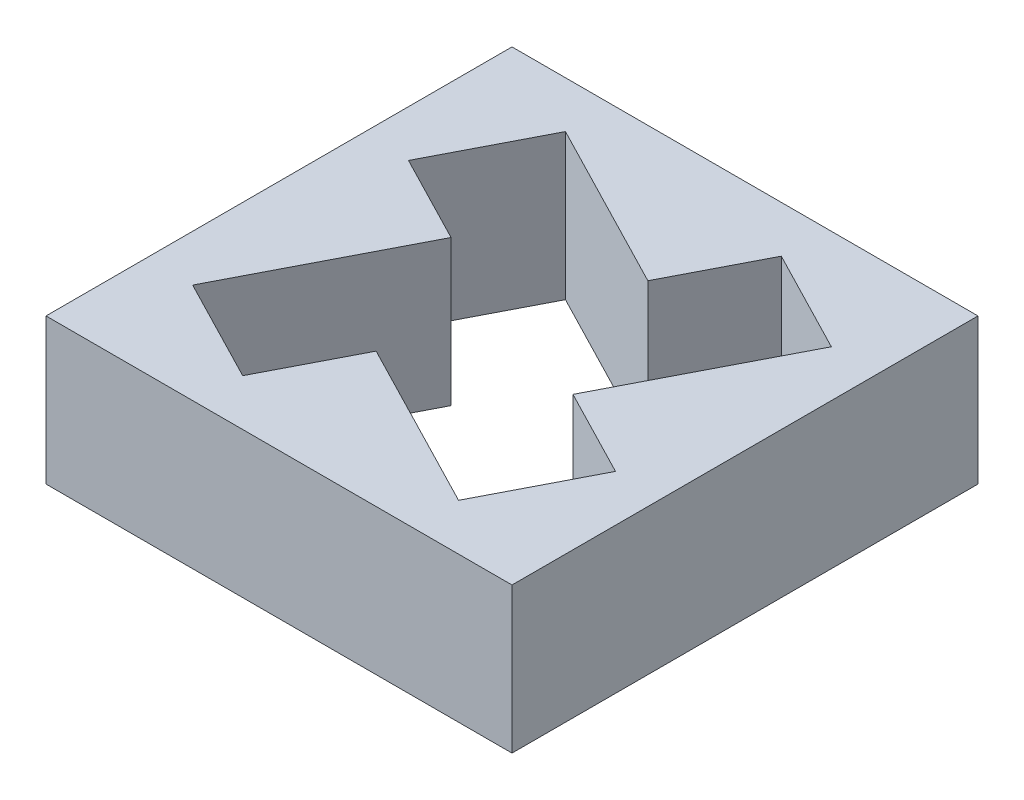
ISO-10303-21;
HEADER;
FILE_DESCRIPTION(('STEP AP214'),'2;1');
FILE_NAME('part.step','',(''),(''),'','','');
FILE_SCHEMA(('AUTOMOTIVE_DESIGN { 1 0 10303 214 1 1 1 1 }'));
ENDSEC;
DATA;
#1=APPLICATION_CONTEXT('core data for automotive mechanical design processes');
#2=APPLICATION_PROTOCOL_DEFINITION('international standard','automotive_design',2000,#1);
#3=PRODUCT_CONTEXT('',#1,'mechanical');
#4=PRODUCT('Part','Part','',(#3));
#5=PRODUCT_RELATED_PRODUCT_CATEGORY('part','',(#4));
#6=PRODUCT_DEFINITION_FORMATION('','',#4);
#7=PRODUCT_DEFINITION_CONTEXT('part definition',#1,'design');
#8=PRODUCT_DEFINITION('design','',#6,#7);
#9=PRODUCT_DEFINITION_SHAPE('','',#8);
#10=(LENGTH_UNIT() NAMED_UNIT(*) SI_UNIT(.MILLI.,.METRE.));
#11=(NAMED_UNIT(*) PLANE_ANGLE_UNIT() SI_UNIT($,.RADIAN.));
#12=(NAMED_UNIT(*) SI_UNIT($,.STERADIAN.) SOLID_ANGLE_UNIT());
#13=UNCERTAINTY_MEASURE_WITH_UNIT(LENGTH_MEASURE(1.E-05),#10,'distance_accuracy_value','');
#14=(GEOMETRIC_REPRESENTATION_CONTEXT(3) GLOBAL_UNCERTAINTY_ASSIGNED_CONTEXT((#13)) GLOBAL_UNIT_ASSIGNED_CONTEXT((#10,
#11,#12)) REPRESENTATION_CONTEXT('',''));
#15=CARTESIAN_POINT('',(0.,0.,0.));
#16=DIRECTION('',(0.,0.,1.));
#17=DIRECTION('',(1.,0.,0.));
#18=AXIS2_PLACEMENT_3D('',#15,#16,#17);
#19=CARTESIAN_POINT('',(0.,25.,0.));
#20=DIRECTION('',(1.,0.,0.));
#21=DIRECTION('',(0.,0.,-1.));
#22=AXIS2_PLACEMENT_3D('',#19,#20,#21);
#23=PLANE('',#22);
#24=DIRECTION('',(0.,0.,1.));
#25=VECTOR('',#24,1.);
#26=CARTESIAN_POINT('',(0.,0.,0.));
#27=LINE('',#26,#25);
#28=CARTESIAN_POINT('',(0.,0.,-80.));
#29=VERTEX_POINT('',#28);
#30=CARTESIAN_POINT('',(0.,0.,0.));
#31=VERTEX_POINT('',#30);
#32=EDGE_CURVE('E259',#29,#31,#27,.T.);
#33=ORIENTED_EDGE('',*,*,#32,.T.);
#34=DIRECTION('',(0.,-1.,0.));
#35=VECTOR('',#34,1.);
#36=CARTESIAN_POINT('',(0.,25.,0.));
#37=LINE('',#36,#35);
#38=CARTESIAN_POINT('',(0.,25.,0.));
#39=VERTEX_POINT('',#38);
#40=EDGE_CURVE('E11',#39,#31,#37,.T.);
#41=ORIENTED_EDGE('',*,*,#40,.F.);
#42=DIRECTION('',(0.,0.,1.));
#43=VECTOR('',#42,1.);
#44=CARTESIAN_POINT('',(0.,25.,0.));
#45=LINE('',#44,#43);
#46=CARTESIAN_POINT('',(0.,25.,-80.));
#47=VERTEX_POINT('',#46);
#48=EDGE_CURVE('E289',#47,#39,#45,.T.);
#49=ORIENTED_EDGE('',*,*,#48,.F.);
#50=DIRECTION('',(0.,-1.,0.));
#51=VECTOR('',#50,1.);
#52=CARTESIAN_POINT('',(0.,25.,-80.));
#53=LINE('',#52,#51);
#54=EDGE_CURVE('E303',#47,#29,#53,.T.);
#55=ORIENTED_EDGE('',*,*,#54,.T.);
#56=EDGE_LOOP('',(#33,#41,#49,#55));
#57=FACE_BOUND('',#56,.T.);
#58=ADVANCED_FACE('F39',(#57),#23,.F.);
#59=CARTESIAN_POINT('',(0.,25.,0.));
#60=DIRECTION('',(0.,0.,-1.));
#61=DIRECTION('',(-1.,0.,0.));
#62=AXIS2_PLACEMENT_3D('',#59,#60,#61);
#63=PLANE('',#62);
#64=DIRECTION('',(1.,0.,0.));
#65=VECTOR('',#64,1.);
#66=CARTESIAN_POINT('',(0.,0.,0.));
#67=LINE('',#66,#65);
#68=CARTESIAN_POINT('',(80.,0.,0.));
#69=VERTEX_POINT('',#68);
#70=EDGE_CURVE('E307',#31,#69,#67,.T.);
#71=ORIENTED_EDGE('',*,*,#70,.T.);
#72=DIRECTION('',(0.,-1.,0.));
#73=VECTOR('',#72,1.);
#74=CARTESIAN_POINT('',(80.,25.,0.));
#75=LINE('',#74,#73);
#76=CARTESIAN_POINT('',(80.,25.,0.));
#77=VERTEX_POINT('',#76);
#78=EDGE_CURVE('E47',#77,#69,#75,.T.);
#79=ORIENTED_EDGE('',*,*,#78,.F.);
#80=DIRECTION('',(1.,0.,0.));
#81=VECTOR('',#80,1.);
#82=CARTESIAN_POINT('',(0.,25.,0.));
#83=LINE('',#82,#81);
#84=EDGE_CURVE('E293',#39,#77,#83,.T.);
#85=ORIENTED_EDGE('',*,*,#84,.F.);
#86=ORIENTED_EDGE('',*,*,#40,.T.);
#87=EDGE_LOOP('',(#71,#79,#85,#86));
#88=FACE_BOUND('',#87,.T.);
#89=ADVANCED_FACE('F341',(#88),#63,.F.);
#90=CARTESIAN_POINT('',(80.,25.,0.));
#91=DIRECTION('',(-1.,0.,0.));
#92=DIRECTION('',(0.,0.,1.));
#93=AXIS2_PLACEMENT_3D('',#90,#91,#92);
#94=PLANE('',#93);
#95=DIRECTION('',(0.,0.,-1.));
#96=VECTOR('',#95,1.);
#97=CARTESIAN_POINT('',(80.,0.,0.));
#98=LINE('',#97,#96);
#99=CARTESIAN_POINT('',(80.,0.,-80.));
#100=VERTEX_POINT('',#99);
#101=EDGE_CURVE('E310',#69,#100,#98,.T.);
#102=ORIENTED_EDGE('',*,*,#101,.T.);
#103=DIRECTION('',(0.,-1.,0.));
#104=VECTOR('',#103,1.);
#105=CARTESIAN_POINT('',(80.,25.,-80.));
#106=LINE('',#105,#104);
#107=CARTESIAN_POINT('',(80.,25.,-80.));
#108=VERTEX_POINT('',#107);
#109=EDGE_CURVE('E318',#108,#100,#106,.T.);
#110=ORIENTED_EDGE('',*,*,#109,.F.);
#111=DIRECTION('',(0.,0.,-1.));
#112=VECTOR('',#111,1.);
#113=CARTESIAN_POINT('',(80.,25.,0.));
#114=LINE('',#113,#112);
#115=EDGE_CURVE('E297',#77,#108,#114,.T.);
#116=ORIENTED_EDGE('',*,*,#115,.F.);
#117=ORIENTED_EDGE('',*,*,#78,.T.);
#118=EDGE_LOOP('',(#102,#110,#116,#117));
#119=FACE_BOUND('',#118,.T.);
#120=ADVANCED_FACE('F327',(#119),#94,.F.);
#121=CARTESIAN_POINT('',(0.,25.,-80.));
#122=DIRECTION('',(0.,0.,1.));
#123=DIRECTION('',(1.,0.,0.));
#124=AXIS2_PLACEMENT_3D('',#121,#122,#123);
#125=PLANE('',#124);
#126=DIRECTION('',(-1.,0.,0.));
#127=VECTOR('',#126,1.);
#128=CARTESIAN_POINT('',(0.,0.,-80.));
#129=LINE('',#128,#127);
#130=EDGE_CURVE('E294',#100,#29,#129,.T.);
#131=ORIENTED_EDGE('',*,*,#130,.T.);
#132=ORIENTED_EDGE('',*,*,#54,.F.);
#133=DIRECTION('',(-1.,0.,0.));
#134=VECTOR('',#133,1.);
#135=CARTESIAN_POINT('',(0.,25.,-80.));
#136=LINE('',#135,#134);
#137=EDGE_CURVE('E300',#108,#47,#136,.T.);
#138=ORIENTED_EDGE('',*,*,#137,.F.);
#139=ORIENTED_EDGE('',*,*,#109,.T.);
#140=EDGE_LOOP('',(#131,#132,#138,#139));
#141=FACE_BOUND('',#140,.T.);
#142=ADVANCED_FACE('F334',(#141),#125,.F.);
#143=CARTESIAN_POINT('',(0.,25.,0.));
#144=DIRECTION('',(0.,-1.,0.));
#145=DIRECTION('',(0.,0.,-1.));
#146=AXIS2_PLACEMENT_3D('',#143,#144,#145);
#147=PLANE('',#146);
#148=DIRECTION('',(-0.458799627653541,0.,0.888539758066555));
#149=VECTOR('',#148,1.);
#150=CARTESIAN_POINT('',(-15.7911471716284,25.,-8.15379658230523));
#151=LINE('',#150,#149);
#152=CARTESIAN_POINT('',(17.1759925530708,25.,-72.));
#153=VERTEX_POINT('',#152);
#154=CARTESIAN_POINT('',(8.,25.,-54.2292048386689));
#155=VERTEX_POINT('',#154);
#156=EDGE_CURVE('E218',#153,#155,#151,.T.);
#157=ORIENTED_EDGE('',*,*,#156,.F.);
#158=DIRECTION('',(-0.888539758066555,0.,-0.458799627653541));
#159=VECTOR('',#158,1.);
#160=CARTESIAN_POINT('',(32.9671397246993,25.,-63.8462034176947));
#161=LINE('',#160,#159);
#162=CARTESIAN_POINT('',(46.4296111685587,25.,-56.8948241128685));
#163=VERTEX_POINT('',#162);
#164=EDGE_CURVE('E54',#163,#153,#161,.T.);
#165=ORIENTED_EDGE('',*,*,#164,.F.);
#166=DIRECTION('',(-0.458799627653541,0.,0.888539758066555));
#167=VECTOR('',#166,1.);
#168=CARTESIAN_POINT('',(13.4624714438594,25.,6.95137930482621));
#169=LINE('',#168,#167);
#170=CARTESIAN_POINT('',(54.2292048386688,25.,-72.));
#171=VERTEX_POINT('',#170);
#172=EDGE_CURVE('E174',#171,#163,#169,.T.);
#173=ORIENTED_EDGE('',*,*,#172,.F.);
#174=DIRECTION('',(-0.888539758066555,0.,-0.458799627653541));
#175=VECTOR('',#174,1.);
#176=CARTESIAN_POINT('',(40.7667333948095,25.,-78.9513793048262));
#177=LINE('',#176,#175);
#178=CARTESIAN_POINT('',(72.,25.,-62.8240074469292));
#179=VERTEX_POINT('',#178);
#180=EDGE_CURVE('E178',#179,#171,#177,.T.);
#181=ORIENTED_EDGE('',*,*,#180,.F.);
#182=DIRECTION('',(0.45879962765354,0.,-0.888539758066555));
#183=VECTOR('',#182,1.);
#184=CARTESIAN_POINT('',(31.2332666051906,25.,16.127371857897));
#185=LINE('',#184,#183);
#186=CARTESIAN_POINT('',(56.8948241128686,25.,-33.5703888314413));
#187=VERTEX_POINT('',#186);
#188=EDGE_CURVE('E249',#187,#179,#185,.T.);
#189=ORIENTED_EDGE('',*,*,#188,.F.);
#190=DIRECTION('',(-0.888539758066555,0.,-0.458799627653541));
#191=VECTOR('',#190,1.);
#192=CARTESIAN_POINT('',(25.661557507678,25.,-49.6977606893383));
#193=LINE('',#192,#191);
#194=CARTESIAN_POINT('',(72.,25.,-25.7707951613311));
#195=VERTEX_POINT('',#194);
#196=EDGE_CURVE('E245',#195,#187,#193,.T.);
#197=ORIENTED_EDGE('',*,*,#196,.F.);
#198=DIRECTION('',(0.45879962765354,0.,-0.888539758066555));
#199=VECTOR('',#198,1.);
#200=CARTESIAN_POINT('',(46.338442492322,25.,23.9269655280072));
#201=LINE('',#200,#199);
#202=CARTESIAN_POINT('',(62.8240074469292,25.,-7.99999999999999));
#203=VERTEX_POINT('',#202);
#204=EDGE_CURVE('E241',#203,#195,#201,.T.);
#205=ORIENTED_EDGE('',*,*,#204,.F.);
#206=DIRECTION('',(0.888539758066555,0.,0.458799627653541));
#207=VECTOR('',#206,1.);
#208=CARTESIAN_POINT('',(16.4855649546072,25.,-31.9269655280072));
#209=LINE('',#208,#207);
#210=CARTESIAN_POINT('',(33.5703888314413,25.,-23.1051758871315));
#211=VERTEX_POINT('',#210);
#212=EDGE_CURVE('E237',#211,#203,#209,.T.);
#213=ORIENTED_EDGE('',*,*,#212,.F.);
#214=DIRECTION('',(0.458799627653541,0.,-0.888539758066555));
#215=VECTOR('',#214,1.);
#216=CARTESIAN_POINT('',(17.0848238768341,25.,8.82178964087579));
#217=LINE('',#216,#215);
#218=CARTESIAN_POINT('',(25.7707951613311,25.,-7.99999999999999));
#219=VERTEX_POINT('',#218);
#220=EDGE_CURVE('E233',#219,#211,#217,.T.);
#221=ORIENTED_EDGE('',*,*,#220,.F.);
#222=DIRECTION('',(0.888539758066555,0.,0.458799627653541));
#223=VECTOR('',#222,1.);
#224=CARTESIAN_POINT('',(8.68597128449698,25.,-16.8217896408758));
#225=LINE('',#224,#223);
#226=CARTESIAN_POINT('',(7.99999999999999,25.,-17.1759925530708));
#227=VERTEX_POINT('',#226);
#228=EDGE_CURVE('E229',#227,#219,#225,.T.);
#229=ORIENTED_EDGE('',*,*,#228,.F.);
#230=DIRECTION('',(-0.458799627653541,0.,0.888539758066555));
#231=VECTOR('',#230,1.);
#232=CARTESIAN_POINT('',(-0.685971284496986,25.,-0.354202912195027));
#233=LINE('',#232,#231);
#234=CARTESIAN_POINT('',(23.1051758871314,25.,-46.4296111685587));
#235=VERTEX_POINT('',#234);
#236=EDGE_CURVE('E225',#235,#227,#233,.T.);
#237=ORIENTED_EDGE('',*,*,#236,.F.);
#238=DIRECTION('',(0.888539758066555,0.,0.458799627653541));
#239=VECTOR('',#238,1.);
#240=CARTESIAN_POINT('',(23.7911471716284,25.,-46.0754082563637));
#241=LINE('',#240,#239);
#242=EDGE_CURVE('E221',#155,#235,#241,.T.);
#243=ORIENTED_EDGE('',*,*,#242,.F.);
#244=EDGE_LOOP('',(#157,#165,#173,#181,#189,#197,#205,#213,#221,#229,#237,#243));
#245=FACE_BOUND('',#244,.T.);
#246=ORIENTED_EDGE('',*,*,#48,.T.);
#247=ORIENTED_EDGE('',*,*,#84,.T.);
#248=ORIENTED_EDGE('',*,*,#115,.T.);
#249=ORIENTED_EDGE('',*,*,#137,.T.);
#250=EDGE_LOOP('',(#246,#247,#248,#249));
#251=FACE_BOUND('',#250,.T.);
#252=ADVANCED_FACE('F340',(#245,#251),#147,.F.);
#253=CARTESIAN_POINT('',(0.,0.,0.));
#254=DIRECTION('',(0.,-1.,0.));
#255=DIRECTION('',(0.,0.,-1.));
#256=AXIS2_PLACEMENT_3D('',#253,#254,#255);
#257=PLANE('',#256);
#258=DIRECTION('',(-0.888539758066555,0.,-0.458799627653541));
#259=VECTOR('',#258,1.);
#260=CARTESIAN_POINT('',(32.9671397246993,0.,-63.8462034176947));
#261=LINE('',#260,#259);
#262=CARTESIAN_POINT('',(46.4296111685587,0.,-56.8948241128685));
#263=VERTEX_POINT('',#262);
#264=CARTESIAN_POINT('',(17.1759925530707,0.,-72.));
#265=VERTEX_POINT('',#264);
#266=EDGE_CURVE('E154',#263,#265,#261,.T.);
#267=ORIENTED_EDGE('',*,*,#266,.T.);
#268=DIRECTION('',(-0.458799627653541,0.,0.888539758066555));
#269=VECTOR('',#268,1.);
#270=CARTESIAN_POINT('',(-15.7911471716284,0.,-8.15379658230523));
#271=LINE('',#270,#269);
#272=CARTESIAN_POINT('',(7.99999999999998,0.,-54.2292048386689));
#273=VERTEX_POINT('',#272);
#274=EDGE_CURVE('E164',#265,#273,#271,.T.);
#275=ORIENTED_EDGE('',*,*,#274,.T.);
#276=DIRECTION('',(0.888539758066555,0.,0.458799627653541));
#277=VECTOR('',#276,1.);
#278=CARTESIAN_POINT('',(23.7911471716284,0.,-46.0754082563637));
#279=LINE('',#278,#277);
#280=CARTESIAN_POINT('',(23.1051758871314,0.,-46.4296111685587));
#281=VERTEX_POINT('',#280);
#282=EDGE_CURVE('E62',#273,#281,#279,.T.);
#283=ORIENTED_EDGE('',*,*,#282,.T.);
#284=DIRECTION('',(-0.458799627653541,0.,0.888539758066555));
#285=VECTOR('',#284,1.);
#286=CARTESIAN_POINT('',(-0.685971284496986,0.,-0.354202912195027));
#287=LINE('',#286,#285);
#288=CARTESIAN_POINT('',(7.99999999999999,0.,-17.1759925530708));
#289=VERTEX_POINT('',#288);
#290=EDGE_CURVE('E183',#281,#289,#287,.T.);
#291=ORIENTED_EDGE('',*,*,#290,.T.);
#292=DIRECTION('',(0.888539758066555,0.,0.458799627653541));
#293=VECTOR('',#292,1.);
#294=CARTESIAN_POINT('',(8.68597128449698,0.,-16.8217896408758));
#295=LINE('',#294,#293);
#296=CARTESIAN_POINT('',(25.7707951613311,0.,-7.99999999999999));
#297=VERTEX_POINT('',#296);
#298=EDGE_CURVE('E187',#289,#297,#295,.T.);
#299=ORIENTED_EDGE('',*,*,#298,.T.);
#300=DIRECTION('',(0.458799627653541,0.,-0.888539758066555));
#301=VECTOR('',#300,1.);
#302=CARTESIAN_POINT('',(17.0848238768341,0.,8.82178964087579));
#303=LINE('',#302,#301);
#304=CARTESIAN_POINT('',(33.5703888314413,0.,-23.1051758871315));
#305=VERTEX_POINT('',#304);
#306=EDGE_CURVE('E191',#297,#305,#303,.T.);
#307=ORIENTED_EDGE('',*,*,#306,.T.);
#308=DIRECTION('',(0.888539758066555,0.,0.458799627653541));
#309=VECTOR('',#308,1.);
#310=CARTESIAN_POINT('',(16.4855649546072,0.,-31.9269655280072));
#311=LINE('',#310,#309);
#312=CARTESIAN_POINT('',(62.8240074469292,0.,-7.99999999999999));
#313=VERTEX_POINT('',#312);
#314=EDGE_CURVE('E195',#305,#313,#311,.T.);
#315=ORIENTED_EDGE('',*,*,#314,.T.);
#316=DIRECTION('',(0.45879962765354,0.,-0.888539758066555));
#317=VECTOR('',#316,1.);
#318=CARTESIAN_POINT('',(46.338442492322,0.,23.9269655280072));
#319=LINE('',#318,#317);
#320=CARTESIAN_POINT('',(72.,0.,-25.7707951613311));
#321=VERTEX_POINT('',#320);
#322=EDGE_CURVE('E199',#313,#321,#319,.T.);
#323=ORIENTED_EDGE('',*,*,#322,.T.);
#324=DIRECTION('',(-0.888539758066555,0.,-0.458799627653541));
#325=VECTOR('',#324,1.);
#326=CARTESIAN_POINT('',(25.661557507678,0.,-49.6977606893383));
#327=LINE('',#326,#325);
#328=CARTESIAN_POINT('',(56.8948241128686,0.,-33.5703888314413));
#329=VERTEX_POINT('',#328);
#330=EDGE_CURVE('E203',#321,#329,#327,.T.);
#331=ORIENTED_EDGE('',*,*,#330,.T.);
#332=DIRECTION('',(0.45879962765354,0.,-0.888539758066555));
#333=VECTOR('',#332,1.);
#334=CARTESIAN_POINT('',(31.2332666051906,0.,16.127371857897));
#335=LINE('',#334,#333);
#336=CARTESIAN_POINT('',(72.,0.,-62.8240074469292));
#337=VERTEX_POINT('',#336);
#338=EDGE_CURVE('E207',#329,#337,#335,.T.);
#339=ORIENTED_EDGE('',*,*,#338,.T.);
#340=DIRECTION('',(-0.888539758066555,0.,-0.458799627653541));
#341=VECTOR('',#340,1.);
#342=CARTESIAN_POINT('',(40.7667333948095,0.,-78.9513793048262));
#343=LINE('',#342,#341);
#344=CARTESIAN_POINT('',(54.2292048386688,0.,-72.));
#345=VERTEX_POINT('',#344);
#346=EDGE_CURVE('E211',#337,#345,#343,.T.);
#347=ORIENTED_EDGE('',*,*,#346,.T.);
#348=DIRECTION('',(-0.458799627653541,0.,0.888539758066555));
#349=VECTOR('',#348,1.);
#350=CARTESIAN_POINT('',(13.4624714438594,0.,6.95137930482621));
#351=LINE('',#350,#349);
#352=EDGE_CURVE('E161',#345,#263,#351,.T.);
#353=ORIENTED_EDGE('',*,*,#352,.T.);
#354=EDGE_LOOP('',(#267,#275,#283,#291,#299,#307,#315,#323,#331,#339,#347,#353));
#355=FACE_BOUND('',#354,.T.);
#356=ORIENTED_EDGE('',*,*,#32,.F.);
#357=ORIENTED_EDGE('',*,*,#130,.F.);
#358=ORIENTED_EDGE('',*,*,#101,.F.);
#359=ORIENTED_EDGE('',*,*,#70,.F.);
#360=EDGE_LOOP('',(#356,#357,#358,#359));
#361=FACE_BOUND('',#360,.T.);
#362=ADVANCED_FACE('F169',(#355,#361),#257,.T.);
#363=CARTESIAN_POINT('',(32.9671397246993,0.,-63.8462034176947));
#364=DIRECTION('',(0.458799627653541,0.,-0.888539758066555));
#365=DIRECTION('',(-0.888539758066555,0.,-0.458799627653541));
#366=AXIS2_PLACEMENT_3D('',#363,#364,#365);
#367=PLANE('',#366);
#368=ORIENTED_EDGE('',*,*,#164,.T.);
#369=DIRECTION('',(0.,1.,0.));
#370=VECTOR('',#369,1.);
#371=CARTESIAN_POINT('',(17.1759925530707,0.,-72.));
#372=LINE('',#371,#370);
#373=EDGE_CURVE('E150',#265,#153,#372,.T.);
#374=ORIENTED_EDGE('',*,*,#373,.F.);
#375=ORIENTED_EDGE('',*,*,#266,.F.);
#376=DIRECTION('',(0.,1.,0.));
#377=VECTOR('',#376,1.);
#378=CARTESIAN_POINT('',(46.4296111685587,0.,-56.8948241128685));
#379=LINE('',#378,#377);
#380=EDGE_CURVE('E256',#263,#163,#379,.T.);
#381=ORIENTED_EDGE('',*,*,#380,.T.);
#382=EDGE_LOOP('',(#368,#374,#375,#381));
#383=FACE_BOUND('',#382,.T.);
#384=ADVANCED_FACE('F152',(#383),#367,.F.);
#385=CARTESIAN_POINT('',(13.4624714438594,0.,6.95137930482621));
#386=DIRECTION('',(-0.888539758066555,0.,-0.458799627653541));
#387=DIRECTION('',(-0.458799627653541,0.,0.888539758066555));
#388=AXIS2_PLACEMENT_3D('',#385,#386,#387);
#389=PLANE('',#388);
#390=ORIENTED_EDGE('',*,*,#172,.T.);
#391=ORIENTED_EDGE('',*,*,#380,.F.);
#392=ORIENTED_EDGE('',*,*,#352,.F.);
#393=DIRECTION('',(0.,1.,0.));
#394=VECTOR('',#393,1.);
#395=CARTESIAN_POINT('',(54.2292048386688,0.,-72.));
#396=LINE('',#395,#394);
#397=EDGE_CURVE('E260',#345,#171,#396,.T.);
#398=ORIENTED_EDGE('',*,*,#397,.T.);
#399=EDGE_LOOP('',(#390,#391,#392,#398));
#400=FACE_BOUND('',#399,.T.);
#401=ADVANCED_FACE('F358',(#400),#389,.F.);
#402=CARTESIAN_POINT('',(40.7667333948095,0.,-78.9513793048262));
#403=DIRECTION('',(0.458799627653541,0.,-0.888539758066555));
#404=DIRECTION('',(-0.888539758066555,0.,-0.458799627653541));
#405=AXIS2_PLACEMENT_3D('',#402,#403,#404);
#406=PLANE('',#405);
#407=ORIENTED_EDGE('',*,*,#180,.T.);
#408=ORIENTED_EDGE('',*,*,#397,.F.);
#409=ORIENTED_EDGE('',*,*,#346,.F.);
#410=DIRECTION('',(0.,1.,0.));
#411=VECTOR('',#410,1.);
#412=CARTESIAN_POINT('',(72.,0.,-62.8240074469292));
#413=LINE('',#412,#411);
#414=EDGE_CURVE('E263',#337,#179,#413,.T.);
#415=ORIENTED_EDGE('',*,*,#414,.T.);
#416=EDGE_LOOP('',(#407,#408,#409,#415));
#417=FACE_BOUND('',#416,.T.);
#418=ADVANCED_FACE('F391',(#417),#406,.F.);
#419=CARTESIAN_POINT('',(31.2332666051906,0.,16.127371857897));
#420=DIRECTION('',(0.888539758066555,0.,0.45879962765354));
#421=DIRECTION('',(0.45879962765354,0.,-0.888539758066555));
#422=AXIS2_PLACEMENT_3D('',#419,#420,#421);
#423=PLANE('',#422);
#424=ORIENTED_EDGE('',*,*,#188,.T.);
#425=ORIENTED_EDGE('',*,*,#414,.F.);
#426=ORIENTED_EDGE('',*,*,#338,.F.);
#427=DIRECTION('',(0.,1.,0.));
#428=VECTOR('',#427,1.);
#429=CARTESIAN_POINT('',(56.8948241128686,0.,-33.5703888314413));
#430=LINE('',#429,#428);
#431=EDGE_CURVE('E266',#329,#187,#430,.T.);
#432=ORIENTED_EDGE('',*,*,#431,.T.);
#433=EDGE_LOOP('',(#424,#425,#426,#432));
#434=FACE_BOUND('',#433,.T.);
#435=ADVANCED_FACE('F387',(#434),#423,.F.);
#436=CARTESIAN_POINT('',(25.661557507678,0.,-49.6977606893383));
#437=DIRECTION('',(0.45879962765354,0.,-0.888539758066555));
#438=DIRECTION('',(-0.888539758066555,0.,-0.45879962765354));
#439=AXIS2_PLACEMENT_3D('',#436,#437,#438);
#440=PLANE('',#439);
#441=ORIENTED_EDGE('',*,*,#196,.T.);
#442=ORIENTED_EDGE('',*,*,#431,.F.);
#443=ORIENTED_EDGE('',*,*,#330,.F.);
#444=DIRECTION('',(0.,1.,0.));
#445=VECTOR('',#444,1.);
#446=CARTESIAN_POINT('',(72.,0.,-25.7707951613311));
#447=LINE('',#446,#445);
#448=EDGE_CURVE('E269',#321,#195,#447,.T.);
#449=ORIENTED_EDGE('',*,*,#448,.T.);
#450=EDGE_LOOP('',(#441,#442,#443,#449));
#451=FACE_BOUND('',#450,.T.);
#452=ADVANCED_FACE('F383',(#451),#440,.F.);
#453=CARTESIAN_POINT('',(46.338442492322,0.,23.9269655280072));
#454=DIRECTION('',(0.888539758066555,0.,0.45879962765354));
#455=DIRECTION('',(0.45879962765354,0.,-0.888539758066555));
#456=AXIS2_PLACEMENT_3D('',#453,#454,#455);
#457=PLANE('',#456);
#458=ORIENTED_EDGE('',*,*,#204,.T.);
#459=ORIENTED_EDGE('',*,*,#448,.F.);
#460=ORIENTED_EDGE('',*,*,#322,.F.);
#461=DIRECTION('',(0.,1.,0.));
#462=VECTOR('',#461,1.);
#463=CARTESIAN_POINT('',(62.8240074469292,0.,-7.99999999999999));
#464=LINE('',#463,#462);
#465=EDGE_CURVE('E272',#313,#203,#464,.T.);
#466=ORIENTED_EDGE('',*,*,#465,.T.);
#467=EDGE_LOOP('',(#458,#459,#460,#466));
#468=FACE_BOUND('',#467,.T.);
#469=ADVANCED_FACE('F379',(#468),#457,.F.);
#470=CARTESIAN_POINT('',(16.4855649546072,0.,-31.9269655280072));
#471=DIRECTION('',(-0.458799627653541,0.,0.888539758066555));
#472=DIRECTION('',(0.888539758066555,0.,0.458799627653541));
#473=AXIS2_PLACEMENT_3D('',#470,#471,#472);
#474=PLANE('',#473);
#475=ORIENTED_EDGE('',*,*,#212,.T.);
#476=ORIENTED_EDGE('',*,*,#465,.F.);
#477=ORIENTED_EDGE('',*,*,#314,.F.);
#478=DIRECTION('',(0.,1.,0.));
#479=VECTOR('',#478,1.);
#480=CARTESIAN_POINT('',(33.5703888314413,0.,-23.1051758871315));
#481=LINE('',#480,#479);
#482=EDGE_CURVE('E275',#305,#211,#481,.T.);
#483=ORIENTED_EDGE('',*,*,#482,.T.);
#484=EDGE_LOOP('',(#475,#476,#477,#483));
#485=FACE_BOUND('',#484,.T.);
#486=ADVANCED_FACE('F375',(#485),#474,.F.);
#487=CARTESIAN_POINT('',(17.0848238768341,0.,8.82178964087579));
#488=DIRECTION('',(0.888539758066555,0.,0.458799627653541));
#489=DIRECTION('',(0.458799627653541,0.,-0.888539758066555));
#490=AXIS2_PLACEMENT_3D('',#487,#488,#489);
#491=PLANE('',#490);
#492=ORIENTED_EDGE('',*,*,#220,.T.);
#493=ORIENTED_EDGE('',*,*,#482,.F.);
#494=ORIENTED_EDGE('',*,*,#306,.F.);
#495=DIRECTION('',(0.,1.,0.));
#496=VECTOR('',#495,1.);
#497=CARTESIAN_POINT('',(25.7707951613311,0.,-7.99999999999999));
#498=LINE('',#497,#496);
#499=EDGE_CURVE('E278',#297,#219,#498,.T.);
#500=ORIENTED_EDGE('',*,*,#499,.T.);
#501=EDGE_LOOP('',(#492,#493,#494,#500));
#502=FACE_BOUND('',#501,.T.);
#503=ADVANCED_FACE('F371',(#502),#491,.F.);
#504=CARTESIAN_POINT('',(8.68597128449698,0.,-16.8217896408758));
#505=DIRECTION('',(-0.458799627653541,0.,0.888539758066555));
#506=DIRECTION('',(0.888539758066555,0.,0.458799627653541));
#507=AXIS2_PLACEMENT_3D('',#504,#505,#506);
#508=PLANE('',#507);
#509=ORIENTED_EDGE('',*,*,#228,.T.);
#510=ORIENTED_EDGE('',*,*,#499,.F.);
#511=ORIENTED_EDGE('',*,*,#298,.F.);
#512=DIRECTION('',(0.,1.,0.));
#513=VECTOR('',#512,1.);
#514=CARTESIAN_POINT('',(7.99999999999999,0.,-17.1759925530708));
#515=LINE('',#514,#513);
#516=EDGE_CURVE('E281',#289,#227,#515,.T.);
#517=ORIENTED_EDGE('',*,*,#516,.T.);
#518=EDGE_LOOP('',(#509,#510,#511,#517));
#519=FACE_BOUND('',#518,.T.);
#520=ADVANCED_FACE('F367',(#519),#508,.F.);
#521=CARTESIAN_POINT('',(-0.685971284496986,0.,-0.354202912195027));
#522=DIRECTION('',(-0.888539758066555,0.,-0.458799627653541));
#523=DIRECTION('',(-0.458799627653541,0.,0.888539758066555));
#524=AXIS2_PLACEMENT_3D('',#521,#522,#523);
#525=PLANE('',#524);
#526=ORIENTED_EDGE('',*,*,#236,.T.);
#527=ORIENTED_EDGE('',*,*,#516,.F.);
#528=ORIENTED_EDGE('',*,*,#290,.F.);
#529=DIRECTION('',(0.,1.,0.));
#530=VECTOR('',#529,1.);
#531=CARTESIAN_POINT('',(23.1051758871314,0.,-46.4296111685587));
#532=LINE('',#531,#530);
#533=EDGE_CURVE('E284',#281,#235,#532,.T.);
#534=ORIENTED_EDGE('',*,*,#533,.T.);
#535=EDGE_LOOP('',(#526,#527,#528,#534));
#536=FACE_BOUND('',#535,.T.);
#537=ADVANCED_FACE('F364',(#536),#525,.F.);
#538=CARTESIAN_POINT('',(23.7911471716284,0.,-46.0754082563637));
#539=DIRECTION('',(-0.458799627653541,0.,0.888539758066555));
#540=DIRECTION('',(0.888539758066555,0.,0.458799627653541));
#541=AXIS2_PLACEMENT_3D('',#538,#539,#540);
#542=PLANE('',#541);
#543=ORIENTED_EDGE('',*,*,#242,.T.);
#544=ORIENTED_EDGE('',*,*,#533,.F.);
#545=ORIENTED_EDGE('',*,*,#282,.F.);
#546=DIRECTION('',(0.,1.,0.));
#547=VECTOR('',#546,1.);
#548=CARTESIAN_POINT('',(8.,0.,-54.2292048386689));
#549=LINE('',#548,#547);
#550=EDGE_CURVE('E160',#273,#155,#549,.T.);
#551=ORIENTED_EDGE('',*,*,#550,.T.);
#552=EDGE_LOOP('',(#543,#544,#545,#551));
#553=FACE_BOUND('',#552,.T.);
#554=ADVANCED_FACE('F361',(#553),#542,.F.);
#555=CARTESIAN_POINT('',(-15.7911471716284,0.,-8.15379658230523));
#556=DIRECTION('',(-0.888539758066555,0.,-0.458799627653541));
#557=DIRECTION('',(-0.458799627653541,0.,0.888539758066555));
#558=AXIS2_PLACEMENT_3D('',#555,#556,#557);
#559=PLANE('',#558);
#560=ORIENTED_EDGE('',*,*,#156,.T.);
#561=ORIENTED_EDGE('',*,*,#550,.F.);
#562=ORIENTED_EDGE('',*,*,#274,.F.);
#563=ORIENTED_EDGE('',*,*,#373,.T.);
#564=EDGE_LOOP('',(#560,#561,#562,#563));
#565=FACE_BOUND('',#564,.T.);
#566=ADVANCED_FACE('F165',(#565),#559,.F.);
#567=CLOSED_SHELL('',(#58,#89,#120,#142,#252,#362,#384,#401,#418,#435,#452,#469,#486,#503,#520,
#537,#554,#566));
#568=MANIFOLD_SOLID_BREP('B2',#567);
#569=ADVANCED_BREP_SHAPE_REPRESENTATION('',(#18,#568),#14);
#570=SHAPE_DEFINITION_REPRESENTATION(#9,#569);
ENDSEC;
END-ISO-10303-21;
